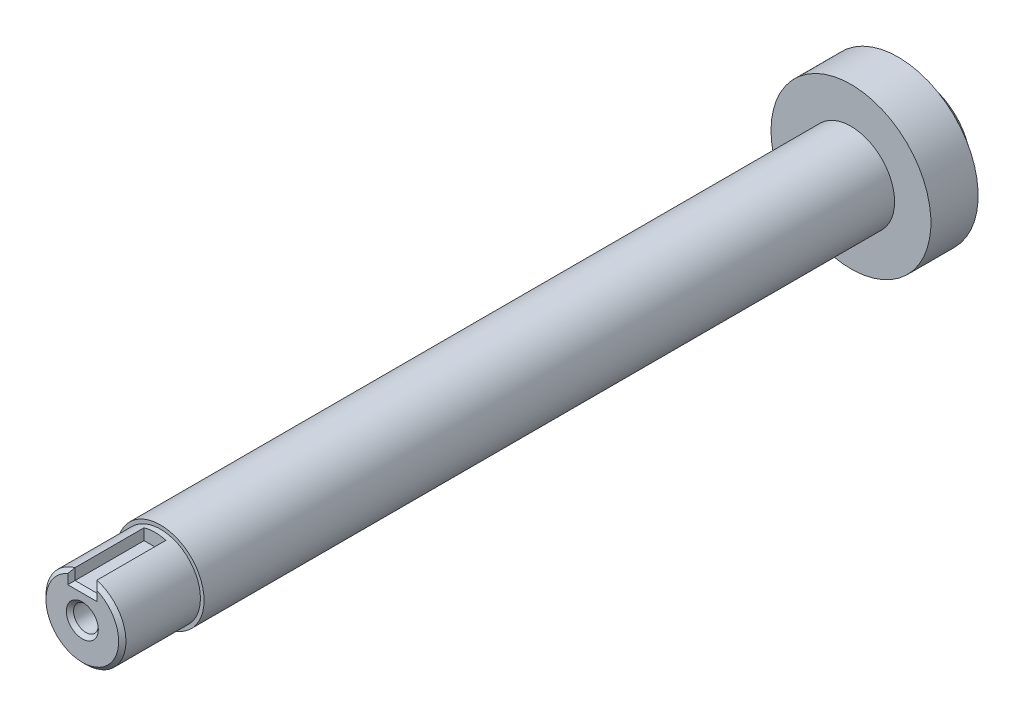
ISO-10303-21;
HEADER;
FILE_DESCRIPTION(('STEP AP214'),'2;1');
FILE_NAME('part.step','',(''),(''),'','','');
FILE_SCHEMA(('AUTOMOTIVE_DESIGN { 1 0 10303 214 1 1 1 1 }'));
ENDSEC;
DATA;
#1=APPLICATION_CONTEXT('core data for automotive mechanical design processes');
#2=APPLICATION_PROTOCOL_DEFINITION('international standard','automotive_design',2000,#1);
#3=PRODUCT_CONTEXT('',#1,'mechanical');
#4=PRODUCT('Part','Part','',(#3));
#5=PRODUCT_RELATED_PRODUCT_CATEGORY('part','',(#4));
#6=PRODUCT_DEFINITION_FORMATION('','',#4);
#7=PRODUCT_DEFINITION_CONTEXT('part definition',#1,'design');
#8=PRODUCT_DEFINITION('design','',#6,#7);
#9=PRODUCT_DEFINITION_SHAPE('','',#8);
#10=(LENGTH_UNIT() NAMED_UNIT(*) SI_UNIT(.MILLI.,.METRE.));
#11=(NAMED_UNIT(*) PLANE_ANGLE_UNIT() SI_UNIT($,.RADIAN.));
#12=(NAMED_UNIT(*) SI_UNIT($,.STERADIAN.) SOLID_ANGLE_UNIT());
#13=UNCERTAINTY_MEASURE_WITH_UNIT(LENGTH_MEASURE(1.E-05),#10,'distance_accuracy_value','');
#14=(GEOMETRIC_REPRESENTATION_CONTEXT(3) GLOBAL_UNCERTAINTY_ASSIGNED_CONTEXT((#13)) GLOBAL_UNIT_ASSIGNED_CONTEXT((#10,
#11,#12)) REPRESENTATION_CONTEXT('',''));
#15=CARTESIAN_POINT('',(0.,0.,0.));
#16=DIRECTION('',(0.,0.,1.));
#17=DIRECTION('',(1.,0.,0.));
#18=AXIS2_PLACEMENT_3D('',#15,#16,#17);
#19=CARTESIAN_POINT('',(0.,0.,19.));
#20=DIRECTION('',(0.,0.,-1.));
#21=DIRECTION('',(-1.,0.,0.));
#22=AXIS2_PLACEMENT_3D('',#19,#20,#21);
#23=CYLINDRICAL_SURFACE('',#22,22.);
#24=CARTESIAN_POINT('',(0.,0.,19.));
#25=DIRECTION('',(0.,0.,-1.));
#26=DIRECTION('',(-1.,0.,0.));
#27=AXIS2_PLACEMENT_3D('',#24,#25,#26);
#28=CIRCLE('',#27,22.);
#29=CARTESIAN_POINT('',(-22.,0.,19.));
#30=VERTEX_POINT('',#29);
#31=EDGE_CURVE('E146',#30,#30,#28,.T.);
#32=ORIENTED_EDGE('',*,*,#31,.T.);
#33=EDGE_LOOP('',(#32));
#34=FACE_BOUND('',#33,.T.);
#35=CARTESIAN_POINT('',(0.,0.,6.));
#36=DIRECTION('',(0.,0.,-1.));
#37=DIRECTION('',(-1.,0.,0.));
#38=AXIS2_PLACEMENT_3D('',#35,#36,#37);
#39=CIRCLE('',#38,22.);
#40=CARTESIAN_POINT('',(-22.,0.,6.));
#41=VERTEX_POINT('',#40);
#42=EDGE_CURVE('E143',#41,#41,#39,.T.);
#43=ORIENTED_EDGE('',*,*,#42,.F.);
#44=EDGE_LOOP('',(#43));
#45=FACE_BOUND('',#44,.T.);
#46=ADVANCED_FACE('F43',(#34,#45),#23,.T.);
#47=CARTESIAN_POINT('',(22.,0.,19.));
#48=DIRECTION('',(0.,0.,1.));
#49=DIRECTION('',(1.,0.,0.));
#50=AXIS2_PLACEMENT_3D('',#47,#48,#49);
#51=PLANE('',#50);
#52=CARTESIAN_POINT('',(0.,0.,19.));
#53=DIRECTION('',(0.,0.,1.));
#54=DIRECTION('',(1.,0.,0.));
#55=AXIS2_PLACEMENT_3D('',#52,#53,#54);
#56=CIRCLE('',#55,12.);
#57=CARTESIAN_POINT('',(12.,0.,19.));
#58=VERTEX_POINT('',#57);
#59=EDGE_CURVE('E145',#58,#58,#56,.T.);
#60=ORIENTED_EDGE('',*,*,#59,.F.);
#61=EDGE_LOOP('',(#60));
#62=FACE_BOUND('',#61,.T.);
#63=ORIENTED_EDGE('',*,*,#31,.F.);
#64=EDGE_LOOP('',(#63));
#65=FACE_BOUND('',#64,.T.);
#66=ADVANCED_FACE('F241',(#62,#65),#51,.T.);
#67=CARTESIAN_POINT('',(0.,0.,6.));
#68=DIRECTION('',(0.,0.,-1.));
#69=DIRECTION('',(-1.,0.,0.));
#70=AXIS2_PLACEMENT_3D('',#67,#68,#69);
#71=PLANE('',#70);
#72=CARTESIAN_POINT('',(0.,0.,6.));
#73=DIRECTION('',(0.,0.,-1.));
#74=DIRECTION('',(0.,1.,0.));
#75=AXIS2_PLACEMENT_3D('',#72,#73,#74);
#76=CIRCLE('',#75,15.);
#77=CARTESIAN_POINT('',(0.,15.,6.));
#78=VERTEX_POINT('',#77);
#79=EDGE_CURVE('E129',#78,#78,#76,.T.);
#80=ORIENTED_EDGE('',*,*,#79,.F.);
#81=EDGE_LOOP('',(#80));
#82=FACE_BOUND('',#81,.T.);
#83=ORIENTED_EDGE('',*,*,#42,.T.);
#84=EDGE_LOOP('',(#83));
#85=FACE_BOUND('',#84,.T.);
#86=ADVANCED_FACE('F246',(#82,#85),#71,.T.);
#87=CARTESIAN_POINT('',(0.,0.,209.));
#88=DIRECTION('',(0.,0.,-1.));
#89=DIRECTION('',(-1.,0.,0.));
#90=AXIS2_PLACEMENT_3D('',#87,#88,#89);
#91=CYLINDRICAL_SURFACE('',#90,12.);
#92=CARTESIAN_POINT('',(0.,0.,209.));
#93=DIRECTION('',(0.,0.,1.));
#94=DIRECTION('',(1.,0.,0.));
#95=AXIS2_PLACEMENT_3D('',#92,#93,#94);
#96=CIRCLE('',#95,12.);
#97=CARTESIAN_POINT('',(12.,0.,209.));
#98=VERTEX_POINT('',#97);
#99=EDGE_CURVE('E134',#98,#98,#96,.T.);
#100=ORIENTED_EDGE('',*,*,#99,.F.);
#101=EDGE_LOOP('',(#100));
#102=FACE_BOUND('',#101,.T.);
#103=ORIENTED_EDGE('',*,*,#59,.T.);
#104=EDGE_LOOP('',(#103));
#105=FACE_BOUND('',#104,.T.);
#106=ADVANCED_FACE('F254',(#102,#105),#91,.T.);
#107=CARTESIAN_POINT('',(0.,0.,209.));
#108=DIRECTION('',(0.,0.,1.));
#109=DIRECTION('',(1.,0.,0.));
#110=AXIS2_PLACEMENT_3D('',#107,#108,#109);
#111=PLANE('',#110);
#112=CARTESIAN_POINT('',(0.,0.,209.));
#113=DIRECTION('',(0.,0.,1.));
#114=DIRECTION('',(1.,0.,0.));
#115=AXIS2_PLACEMENT_3D('',#112,#113,#114);
#116=CIRCLE('',#115,11.);
#117=CARTESIAN_POINT('',(11.,0.,209.));
#118=VERTEX_POINT('',#117);
#119=EDGE_CURVE('E139',#118,#118,#116,.T.);
#120=ORIENTED_EDGE('',*,*,#119,.F.);
#121=EDGE_LOOP('',(#120));
#122=FACE_BOUND('',#121,.T.);
#123=ORIENTED_EDGE('',*,*,#99,.T.);
#124=EDGE_LOOP('',(#123));
#125=FACE_BOUND('',#124,.T.);
#126=ADVANCED_FACE('F260',(#122,#125),#111,.T.);
#127=CARTESIAN_POINT('',(0.,0.,230.5));
#128=DIRECTION('',(0.,0.,-1.));
#129=DIRECTION('',(-1.,0.,0.));
#130=AXIS2_PLACEMENT_3D('',#127,#128,#129);
#131=CYLINDRICAL_SURFACE('',#130,11.);
#132=DIRECTION('',(0.,0.,1.));
#133=VECTOR('',#132,1.);
#134=CARTESIAN_POINT('',(3.,10.5830052442584,210.5));
#135=LINE('',#134,#133);
#136=CARTESIAN_POINT('',(3.,10.5830052442584,210.5));
#137=VERTEX_POINT('',#136);
#138=CARTESIAN_POINT('',(3.,10.5830052442584,229.5));
#139=VERTEX_POINT('',#138);
#140=EDGE_CURVE('E115',#137,#139,#135,.T.);
#141=ORIENTED_EDGE('',*,*,#140,.T.);
#142=CARTESIAN_POINT('',(0.,0.,229.5));
#143=DIRECTION('',(0.,0.,1.));
#144=DIRECTION('',(1.,0.,0.));
#145=AXIS2_PLACEMENT_3D('',#142,#143,#144);
#146=CIRCLE('',#145,11.);
#147=CARTESIAN_POINT('',(-3.,10.5830052442584,229.5));
#148=VERTEX_POINT('',#147);
#149=EDGE_CURVE('E63',#139,#148,#146,.F.);
#150=ORIENTED_EDGE('',*,*,#149,.T.);
#151=DIRECTION('',(0.,0.,1.));
#152=VECTOR('',#151,1.);
#153=CARTESIAN_POINT('',(-3.,10.5830052442584,210.5));
#154=LINE('',#153,#152);
#155=CARTESIAN_POINT('',(-3.,10.5830052442584,210.5));
#156=VERTEX_POINT('',#155);
#157=EDGE_CURVE('E138',#156,#148,#154,.T.);
#158=ORIENTED_EDGE('',*,*,#157,.F.);
#159=CARTESIAN_POINT('',(0.,0.,210.5));
#160=DIRECTION('',(0.,0.,1.));
#161=DIRECTION('',(1.,0.,0.));
#162=AXIS2_PLACEMENT_3D('',#159,#160,#161);
#163=CIRCLE('',#162,11.);
#164=EDGE_CURVE('E119',#137,#156,#163,.T.);
#165=ORIENTED_EDGE('',*,*,#164,.F.);
#166=EDGE_LOOP('',(#141,#150,#158,#165));
#167=FACE_BOUND('',#166,.T.);
#168=ORIENTED_EDGE('',*,*,#119,.T.);
#169=EDGE_LOOP('',(#168));
#170=FACE_BOUND('',#169,.T.);
#171=ADVANCED_FACE('F226',(#167,#170),#131,.T.);
#172=CARTESIAN_POINT('',(0.,0.,230.5));
#173=DIRECTION('',(0.,0.,1.));
#174=DIRECTION('',(1.,0.,0.));
#175=AXIS2_PLACEMENT_3D('',#172,#173,#174);
#176=PLANE('',#175);
#177=CARTESIAN_POINT('',(0.,0.,230.5));
#178=DIRECTION('',(0.,0.,1.));
#179=DIRECTION('',(1.,0.,0.));
#180=AXIS2_PLACEMENT_3D('',#177,#178,#179);
#181=CIRCLE('',#180,10.0000000000004);
#182=CARTESIAN_POINT('',(-3.99999999999958,9.16515138991231,230.5));
#183=VERTEX_POINT('',#182);
#184=CARTESIAN_POINT('',(3.99999999999958,9.16515138991231,230.5));
#185=VERTEX_POINT('',#184);
#186=EDGE_CURVE('E157',#183,#185,#181,.T.);
#187=ORIENTED_EDGE('',*,*,#186,.T.);
#188=DIRECTION('',(0.,-1.,0.));
#189=VECTOR('',#188,1.);
#190=CARTESIAN_POINT('',(3.99999999999958,7.5,230.5));
#191=LINE('',#190,#189);
#192=CARTESIAN_POINT('',(3.99999999999958,6.50000000000041,230.5));
#193=VERTEX_POINT('',#192);
#194=EDGE_CURVE('E165',#185,#193,#191,.T.);
#195=ORIENTED_EDGE('',*,*,#194,.T.);
#196=DIRECTION('',(-1.,0.,0.));
#197=VECTOR('',#196,1.);
#198=CARTESIAN_POINT('',(-3.,6.50000000000041,230.5));
#199=LINE('',#198,#197);
#200=CARTESIAN_POINT('',(-3.99999999999958,6.50000000000041,230.5));
#201=VERTEX_POINT('',#200);
#202=EDGE_CURVE('E162',#193,#201,#199,.T.);
#203=ORIENTED_EDGE('',*,*,#202,.T.);
#204=DIRECTION('',(0.,1.,0.));
#205=VECTOR('',#204,1.);
#206=CARTESIAN_POINT('',(-3.99999999999958,10.5830052442584,230.5));
#207=LINE('',#206,#205);
#208=EDGE_CURVE('E156',#201,#183,#207,.T.);
#209=ORIENTED_EDGE('',*,*,#208,.T.);
#210=EDGE_LOOP('',(#187,#195,#203,#209));
#211=FACE_BOUND('',#210,.T.);
#212=CARTESIAN_POINT('',(0.,0.,230.5));
#213=DIRECTION('',(0.,0.,1.));
#214=DIRECTION('',(1.,0.,0.));
#215=AXIS2_PLACEMENT_3D('',#212,#213,#214);
#216=CIRCLE('',#215,4.39999999999954);
#217=CARTESIAN_POINT('',(4.39999999999954,0.,230.5));
#218=VERTEX_POINT('',#217);
#219=EDGE_CURVE('E154',#218,#218,#216,.F.);
#220=ORIENTED_EDGE('',*,*,#219,.T.);
#221=EDGE_LOOP('',(#220));
#222=FACE_BOUND('',#221,.T.);
#223=ADVANCED_FACE('F228',(#211,#222),#176,.T.);
#224=CARTESIAN_POINT('',(-3.,7.5,210.5));
#225=DIRECTION('',(0.,-1.,0.));
#226=DIRECTION('',(0.,0.,-1.));
#227=AXIS2_PLACEMENT_3D('',#224,#225,#226);
#228=PLANE('',#227);
#229=DIRECTION('',(0.,0.,1.));
#230=VECTOR('',#229,1.);
#231=CARTESIAN_POINT('',(-3.,7.5,210.5));
#232=LINE('',#231,#230);
#233=CARTESIAN_POINT('',(-3.,7.5,210.5));
#234=VERTEX_POINT('',#233);
#235=CARTESIAN_POINT('',(-3.,7.5,229.5));
#236=VERTEX_POINT('',#235);
#237=EDGE_CURVE('E131',#234,#236,#232,.T.);
#238=ORIENTED_EDGE('',*,*,#237,.T.);
#239=DIRECTION('',(1.,0.,0.));
#240=VECTOR('',#239,1.);
#241=CARTESIAN_POINT('',(3.,7.5,229.5));
#242=LINE('',#241,#240);
#243=CARTESIAN_POINT('',(3.,7.5,229.5));
#244=VERTEX_POINT('',#243);
#245=EDGE_CURVE('E108',#236,#244,#242,.T.);
#246=ORIENTED_EDGE('',*,*,#245,.T.);
#247=DIRECTION('',(0.,0.,1.));
#248=VECTOR('',#247,1.);
#249=CARTESIAN_POINT('',(3.,7.5,210.5));
#250=LINE('',#249,#248);
#251=CARTESIAN_POINT('',(3.,7.5,210.5));
#252=VERTEX_POINT('',#251);
#253=EDGE_CURVE('E103',#252,#244,#250,.T.);
#254=ORIENTED_EDGE('',*,*,#253,.F.);
#255=DIRECTION('',(1.,0.,0.));
#256=VECTOR('',#255,1.);
#257=CARTESIAN_POINT('',(-3.,7.5,210.5));
#258=LINE('',#257,#256);
#259=EDGE_CURVE('E102',#234,#252,#258,.T.);
#260=ORIENTED_EDGE('',*,*,#259,.F.);
#261=EDGE_LOOP('',(#238,#246,#254,#260));
#262=FACE_BOUND('',#261,.T.);
#263=ADVANCED_FACE('F101',(#262),#228,.F.);
#264=CARTESIAN_POINT('',(-3.,10.5830052442584,210.5));
#265=DIRECTION('',(-1.,0.,0.));
#266=DIRECTION('',(0.,0.,1.));
#267=AXIS2_PLACEMENT_3D('',#264,#265,#266);
#268=PLANE('',#267);
#269=ORIENTED_EDGE('',*,*,#157,.T.);
#270=DIRECTION('',(0.,-1.,0.));
#271=VECTOR('',#270,1.);
#272=CARTESIAN_POINT('',(-3.,7.5,229.5));
#273=LINE('',#272,#271);
#274=EDGE_CURVE('E66',#148,#236,#273,.T.);
#275=ORIENTED_EDGE('',*,*,#274,.T.);
#276=ORIENTED_EDGE('',*,*,#237,.F.);
#277=DIRECTION('',(0.,-1.,0.));
#278=VECTOR('',#277,1.);
#279=CARTESIAN_POINT('',(-3.,10.5830052442584,210.5));
#280=LINE('',#279,#278);
#281=EDGE_CURVE('E113',#156,#234,#280,.T.);
#282=ORIENTED_EDGE('',*,*,#281,.F.);
#283=EDGE_LOOP('',(#269,#275,#276,#282));
#284=FACE_BOUND('',#283,.T.);
#285=ADVANCED_FACE('F229',(#284),#268,.F.);
#286=CARTESIAN_POINT('',(3.,7.5,210.5));
#287=DIRECTION('',(1.,0.,0.));
#288=DIRECTION('',(0.,0.,-1.));
#289=AXIS2_PLACEMENT_3D('',#286,#287,#288);
#290=PLANE('',#289);
#291=ORIENTED_EDGE('',*,*,#253,.T.);
#292=DIRECTION('',(0.,1.,0.));
#293=VECTOR('',#292,1.);
#294=CARTESIAN_POINT('',(3.,10.5830052442584,229.5));
#295=LINE('',#294,#293);
#296=EDGE_CURVE('E151',#244,#139,#295,.T.);
#297=ORIENTED_EDGE('',*,*,#296,.T.);
#298=ORIENTED_EDGE('',*,*,#140,.F.);
#299=DIRECTION('',(0.,1.,0.));
#300=VECTOR('',#299,1.);
#301=CARTESIAN_POINT('',(3.,7.5,210.5));
#302=LINE('',#301,#300);
#303=EDGE_CURVE('E116',#252,#137,#302,.T.);
#304=ORIENTED_EDGE('',*,*,#303,.F.);
#305=EDGE_LOOP('',(#291,#297,#298,#304));
#306=FACE_BOUND('',#305,.T.);
#307=ADVANCED_FACE('F120',(#306),#290,.F.);
#308=CARTESIAN_POINT('',(0.,0.,210.5));
#309=DIRECTION('',(0.,0.,1.));
#310=DIRECTION('',(1.,0.,0.));
#311=AXIS2_PLACEMENT_3D('',#308,#309,#310);
#312=PLANE('',#311);
#313=ORIENTED_EDGE('',*,*,#259,.T.);
#314=ORIENTED_EDGE('',*,*,#303,.T.);
#315=ORIENTED_EDGE('',*,*,#164,.T.);
#316=ORIENTED_EDGE('',*,*,#281,.T.);
#317=EDGE_LOOP('',(#313,#314,#315,#316));
#318=FACE_BOUND('',#317,.T.);
#319=ADVANCED_FACE('F125',(#318),#312,.T.);
#320=CARTESIAN_POINT('',(0.,0.,0.));
#321=DIRECTION('',(0.,0.,1.));
#322=DIRECTION('',(0.,-1.,0.));
#323=AXIS2_PLACEMENT_3D('',#320,#321,#322);
#324=CYLINDRICAL_SURFACE('',#323,15.);
#325=CARTESIAN_POINT('',(0.,0.,0.999999999999572));
#326=DIRECTION('',(0.,0.,-1.));
#327=DIRECTION('',(0.,1.,0.));
#328=AXIS2_PLACEMENT_3D('',#325,#326,#327);
#329=CIRCLE('',#328,15.);
#330=CARTESIAN_POINT('',(0.,15.,0.999999999999572));
#331=VERTEX_POINT('',#330);
#332=EDGE_CURVE('E52',#331,#331,#329,.F.);
#333=ORIENTED_EDGE('',*,*,#332,.T.);
#334=EDGE_LOOP('',(#333));
#335=FACE_BOUND('',#334,.T.);
#336=ORIENTED_EDGE('',*,*,#79,.T.);
#337=EDGE_LOOP('',(#336));
#338=FACE_BOUND('',#337,.T.);
#339=ADVANCED_FACE('F298',(#335,#338),#324,.T.);
#340=CARTESIAN_POINT('',(0.,0.,0.));
#341=DIRECTION('',(0.,0.,-1.));
#342=DIRECTION('',(0.,1.,0.));
#343=AXIS2_PLACEMENT_3D('',#340,#341,#342);
#344=PLANE('',#343);
#345=CARTESIAN_POINT('',(0.,0.,0.));
#346=DIRECTION('',(0.,0.,-1.));
#347=DIRECTION('',(0.,1.,0.));
#348=AXIS2_PLACEMENT_3D('',#345,#346,#347);
#349=CIRCLE('',#348,13.9999999999995);
#350=CARTESIAN_POINT('',(0.,13.9999999999995,0.));
#351=VERTEX_POINT('',#350);
#352=EDGE_CURVE('E167',#351,#351,#349,.T.);
#353=ORIENTED_EDGE('',*,*,#352,.T.);
#354=EDGE_LOOP('',(#353));
#355=FACE_BOUND('',#354,.T.);
#356=ADVANCED_FACE('F303',(#355),#344,.T.);
#357=CARTESIAN_POINT('',(0.,0.,214.5));
#358=DIRECTION('',(0.,0.,-1.));
#359=DIRECTION('',(-1.,0.,0.));
#360=AXIS2_PLACEMENT_3D('',#357,#358,#359);
#361=PLANE('',#360);
#362=CARTESIAN_POINT('',(0.,0.,214.5));
#363=DIRECTION('',(0.,0.,1.));
#364=DIRECTION('',(1.,0.,0.));
#365=AXIS2_PLACEMENT_3D('',#362,#363,#364);
#366=CIRCLE('',#365,3.39999999999999);
#367=CARTESIAN_POINT('',(3.39999999999999,0.,214.5));
#368=VERTEX_POINT('',#367);
#369=EDGE_CURVE('E121',#368,#368,#366,.T.);
#370=ORIENTED_EDGE('',*,*,#369,.T.);
#371=EDGE_LOOP('',(#370));
#372=FACE_BOUND('',#371,.T.);
#373=ADVANCED_FACE('F312',(#372),#361,.F.);
#374=CARTESIAN_POINT('',(0.,0.,230.5));
#375=DIRECTION('',(0.,0.,1.));
#376=DIRECTION('',(1.,0.,0.));
#377=AXIS2_PLACEMENT_3D('',#374,#375,#376);
#378=CYLINDRICAL_SURFACE('',#377,3.39999999999999);
#379=CARTESIAN_POINT('',(0.,0.,229.5));
#380=DIRECTION('',(0.,0.,1.));
#381=DIRECTION('',(1.,0.,0.));
#382=AXIS2_PLACEMENT_3D('',#379,#380,#381);
#383=CIRCLE('',#382,3.39999999999999);
#384=CARTESIAN_POINT('',(3.39999999999999,0.,229.5));
#385=VERTEX_POINT('',#384);
#386=EDGE_CURVE('E11',#385,#385,#383,.T.);
#387=ORIENTED_EDGE('',*,*,#386,.T.);
#388=EDGE_LOOP('',(#387));
#389=FACE_BOUND('',#388,.T.);
#390=ORIENTED_EDGE('',*,*,#369,.F.);
#391=EDGE_LOOP('',(#390));
#392=FACE_BOUND('',#391,.T.);
#393=ADVANCED_FACE('F207',(#389,#392),#378,.F.);
#394=CARTESIAN_POINT('',(-3.,10.5830052442584,229.5));
#395=DIRECTION('',(0.707106781186862,0.,0.707106781186234));
#396=DIRECTION('',(0.,1.,0.));
#397=AXIS2_PLACEMENT_3D('',#394,#395,#396);
#398=PLANE('',#397);
#399=CARTESIAN_POINT('',(-3.,10.5830052442584,229.5));
#400=CARTESIAN_POINT('',(-3.08620618382193,10.4689629821859,229.586206183822));
#401=CARTESIAN_POINT('',(-3.17176497376608,10.35393816365,229.671764973766));
#402=CARTESIAN_POINT('',(-3.34146026766557,10.121886276106,229.841460267665));
#403=CARTESIAN_POINT('',(-3.42559722061156,10.0048598635752,229.925597220611));
#404=CARTESIAN_POINT('',(-3.59238025532121,9.76868967483153,230.092380255321));
#405=CARTESIAN_POINT('',(-3.67502627828043,9.6495458154699,230.175026278281));
#406=CARTESIAN_POINT('',(-3.83873593989175,9.40903009636702,230.338735939892));
#407=CARTESIAN_POINT('',(-3.91979906034157,9.28765753142429,230.419799060342));
#408=CARTESIAN_POINT('',(-3.99999999999959,9.16515138991232,230.5));
#409=B_SPLINE_CURVE_WITH_KNOTS('',3,(#399,#400,#401,#402,#403,#404,#405,#406,#407,#408),
.UNSPECIFIED.,.F.,.F.,(4,2,2,2,4),(0.,0.500815517284828,1.00146981387006,1.50214381400375,
2.00297906344489),.UNSPECIFIED.);
#410=EDGE_CURVE('E206',#183,#148,#409,.F.);
#411=ORIENTED_EDGE('',*,*,#410,.F.);
#412=ORIENTED_EDGE('',*,*,#208,.F.);
#413=DIRECTION('',(0.577350269189455,0.577350269189455,-0.577350269189968));
#414=VECTOR('',#413,1.);
#415=CARTESIAN_POINT('',(-3.,7.5,229.5));
#416=LINE('',#415,#414);
#417=EDGE_CURVE('E48',#236,#201,#416,.F.);
#418=ORIENTED_EDGE('',*,*,#417,.F.);
#419=ORIENTED_EDGE('',*,*,#274,.F.);
#420=EDGE_LOOP('',(#411,#412,#418,#419));
#421=FACE_BOUND('',#420,.T.);
#422=ADVANCED_FACE('F196',(#421),#398,.T.);
#423=CARTESIAN_POINT('',(-3.,7.5,229.5));
#424=DIRECTION('',(0.,0.707106781186862,0.707106781186234));
#425=DIRECTION('',(-1.,0.,0.));
#426=AXIS2_PLACEMENT_3D('',#423,#424,#425);
#427=PLANE('',#426);
#428=ORIENTED_EDGE('',*,*,#417,.T.);
#429=ORIENTED_EDGE('',*,*,#202,.F.);
#430=DIRECTION('',(-0.577350269189455,0.577350269189455,-0.577350269189968));
#431=VECTOR('',#430,1.);
#432=CARTESIAN_POINT('',(3.,7.5,229.5));
#433=LINE('',#432,#431);
#434=EDGE_CURVE('E182',#244,#193,#433,.F.);
#435=ORIENTED_EDGE('',*,*,#434,.F.);
#436=ORIENTED_EDGE('',*,*,#245,.F.);
#437=EDGE_LOOP('',(#428,#429,#435,#436));
#438=FACE_BOUND('',#437,.T.);
#439=ADVANCED_FACE('F202',(#438),#427,.T.);
#440=CARTESIAN_POINT('',(0.,0.,230.5));
#441=DIRECTION('',(0.,0.,-1.));
#442=DIRECTION('',(-1.,0.,0.));
#443=AXIS2_PLACEMENT_3D('',#440,#441,#442);
#444=CONICAL_SURFACE('',#443,10.0000000000004,0.785398163397004);
#445=ORIENTED_EDGE('',*,*,#410,.T.);
#446=ORIENTED_EDGE('',*,*,#149,.F.);
#447=CARTESIAN_POINT('',(3.,10.5830052442584,229.5));
#448=CARTESIAN_POINT('',(3.08620618382193,10.4689629821859,229.586206183822));
#449=CARTESIAN_POINT('',(3.17176497376608,10.35393816365,229.671764973766));
#450=CARTESIAN_POINT('',(3.34146026766558,10.121886276106,229.841460267665));
#451=CARTESIAN_POINT('',(3.42559722061156,10.0048598635752,229.925597220611));
#452=CARTESIAN_POINT('',(3.59238025532122,9.76868967483152,230.092380255321));
#453=CARTESIAN_POINT('',(3.67502627828044,9.64954581546989,230.175026278281));
#454=CARTESIAN_POINT('',(3.83873593989175,9.40903009636703,230.338735939892));
#455=CARTESIAN_POINT('',(3.91979906034156,9.28765753142429,230.419799060342));
#456=CARTESIAN_POINT('',(3.99999999999959,9.16515138991232,230.5));
#457=B_SPLINE_CURVE_WITH_KNOTS('',3,(#447,#448,#449,#450,#451,#452,#453,#454,#455,#456),
.UNSPECIFIED.,.F.,.F.,(4,2,2,2,4),(0.,0.500815517284831,1.00146981387007,1.50214381400377,
2.00297906344489),.UNSPECIFIED.);
#458=EDGE_CURVE('E174',#185,#139,#457,.F.);
#459=ORIENTED_EDGE('',*,*,#458,.F.);
#460=ORIENTED_EDGE('',*,*,#186,.F.);
#461=EDGE_LOOP('',(#445,#446,#459,#460));
#462=FACE_BOUND('',#461,.T.);
#463=ADVANCED_FACE('F184',(#462),#444,.T.);
#464=CARTESIAN_POINT('',(3.,7.5,229.5));
#465=DIRECTION('',(-0.707106781186862,0.,0.707106781186234));
#466=DIRECTION('',(0.,-1.,0.));
#467=AXIS2_PLACEMENT_3D('',#464,#465,#466);
#468=PLANE('',#467);
#469=ORIENTED_EDGE('',*,*,#434,.T.);
#470=ORIENTED_EDGE('',*,*,#194,.F.);
#471=ORIENTED_EDGE('',*,*,#458,.T.);
#472=ORIENTED_EDGE('',*,*,#296,.F.);
#473=EDGE_LOOP('',(#469,#470,#471,#472));
#474=FACE_BOUND('',#473,.T.);
#475=ADVANCED_FACE('F186',(#474),#468,.T.);
#476=CARTESIAN_POINT('',(0.,0.,0.));
#477=DIRECTION('',(0.,0.,1.));
#478=DIRECTION('',(0.,-1.,0.));
#479=AXIS2_PLACEMENT_3D('',#476,#477,#478);
#480=CONICAL_SURFACE('',#479,13.9999999999995,0.78539816339789);
#481=ORIENTED_EDGE('',*,*,#332,.F.);
#482=EDGE_LOOP('',(#481));
#483=FACE_BOUND('',#482,.T.);
#484=ORIENTED_EDGE('',*,*,#352,.F.);
#485=EDGE_LOOP('',(#484));
#486=FACE_BOUND('',#485,.T.);
#487=ADVANCED_FACE('F198',(#483,#486),#480,.T.);
#488=CARTESIAN_POINT('',(0.,0.,229.5));
#489=DIRECTION('',(0.,0.,1.));
#490=DIRECTION('',(1.,0.,0.));
#491=AXIS2_PLACEMENT_3D('',#488,#489,#490);
#492=CONICAL_SURFACE('',#491,3.39999999999999,0.785398163397003);
#493=ORIENTED_EDGE('',*,*,#219,.F.);
#494=EDGE_LOOP('',(#493));
#495=FACE_BOUND('',#494,.T.);
#496=ORIENTED_EDGE('',*,*,#386,.F.);
#497=EDGE_LOOP('',(#496));
#498=FACE_BOUND('',#497,.T.);
#499=ADVANCED_FACE('F46',(#495,#498),#492,.F.);
#500=CLOSED_SHELL('',(#46,#66,#86,#106,#126,#171,#223,#263,#285,#307,#319,#339,#356,#373,#393,
#422,#439,#463,#475,#487,#499));
#501=MANIFOLD_SOLID_BREP('B2',#500);
#502=ADVANCED_BREP_SHAPE_REPRESENTATION('',(#18,#501),#14);
#503=SHAPE_DEFINITION_REPRESENTATION(#9,#502);
ENDSEC;
END-ISO-10303-21;
